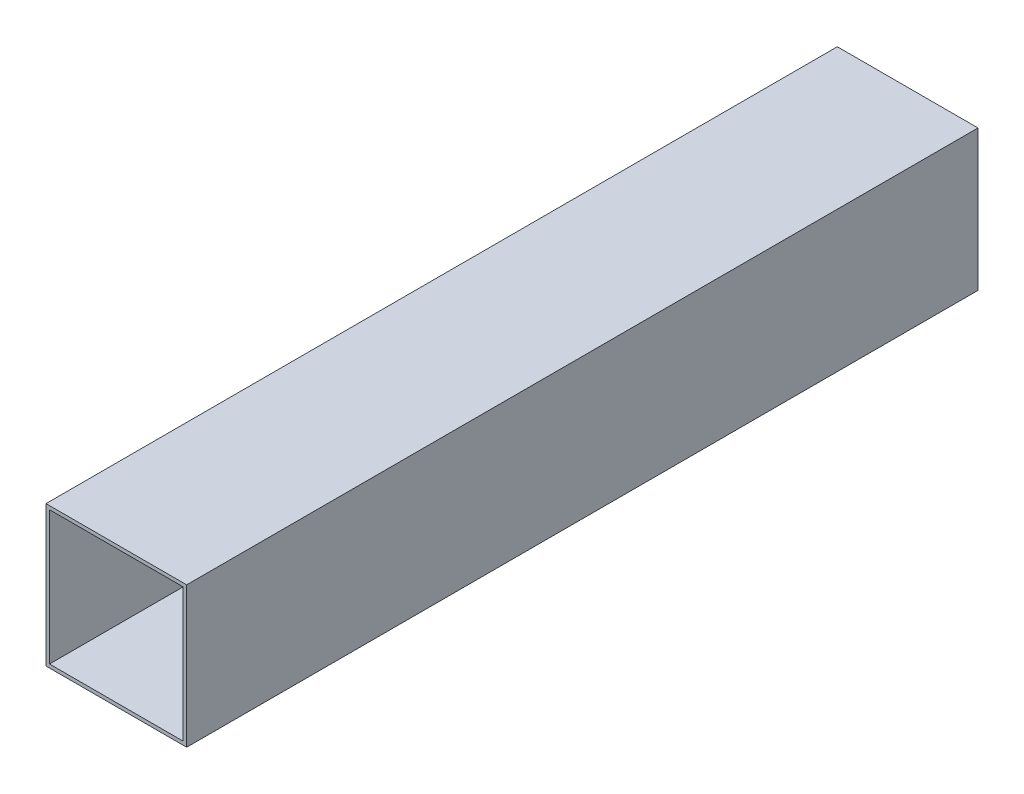
ISO-10303-21;
HEADER;
FILE_DESCRIPTION(('STEP AP214'),'2;1');
FILE_NAME('part.step','',(''),(''),'','','');
FILE_SCHEMA(('AUTOMOTIVE_DESIGN { 1 0 10303 214 1 1 1 1 }'));
ENDSEC;
DATA;
#1=APPLICATION_CONTEXT('core data for automotive mechanical design processes');
#2=APPLICATION_PROTOCOL_DEFINITION('international standard','automotive_design',2000,#1);
#3=PRODUCT_CONTEXT('',#1,'mechanical');
#4=PRODUCT('Part','Part','',(#3));
#5=PRODUCT_RELATED_PRODUCT_CATEGORY('part','',(#4));
#6=PRODUCT_DEFINITION_FORMATION('','',#4);
#7=PRODUCT_DEFINITION_CONTEXT('part definition',#1,'design');
#8=PRODUCT_DEFINITION('design','',#6,#7);
#9=PRODUCT_DEFINITION_SHAPE('','',#8);
#10=(LENGTH_UNIT() NAMED_UNIT(*) SI_UNIT(.MILLI.,.METRE.));
#11=(NAMED_UNIT(*) PLANE_ANGLE_UNIT() SI_UNIT($,.RADIAN.));
#12=(NAMED_UNIT(*) SI_UNIT($,.STERADIAN.) SOLID_ANGLE_UNIT());
#13=UNCERTAINTY_MEASURE_WITH_UNIT(LENGTH_MEASURE(1.E-05),#10,'distance_accuracy_value','');
#14=(GEOMETRIC_REPRESENTATION_CONTEXT(3) GLOBAL_UNCERTAINTY_ASSIGNED_CONTEXT((#13)) GLOBAL_UNIT_ASSIGNED_CONTEXT((#10,
#11,#12)) REPRESENTATION_CONTEXT('',''));
#15=CARTESIAN_POINT('',(0.,0.,0.));
#16=DIRECTION('',(0.,0.,1.));
#17=DIRECTION('',(1.,0.,0.));
#18=AXIS2_PLACEMENT_3D('',#15,#16,#17);
#19=CARTESIAN_POINT('',(0.,0.,225.));
#20=DIRECTION('',(0.,0.,-1.));
#21=DIRECTION('',(-1.,0.,0.));
#22=AXIS2_PLACEMENT_3D('',#19,#20,#21);
#23=PLANE('',#22);
#24=DIRECTION('',(0.,-1.,0.));
#25=VECTOR('',#24,1.);
#26=CARTESIAN_POINT('',(0.,0.,225.));
#27=LINE('',#26,#25);
#28=CARTESIAN_POINT('',(0.,40.,225.));
#29=VERTEX_POINT('',#28);
#30=CARTESIAN_POINT('',(0.,0.,225.));
#31=VERTEX_POINT('',#30);
#32=EDGE_CURVE('E136',#29,#31,#27,.T.);
#33=ORIENTED_EDGE('',*,*,#32,.T.);
#34=DIRECTION('',(1.,0.,0.));
#35=VECTOR('',#34,1.);
#36=CARTESIAN_POINT('',(0.,0.,225.));
#37=LINE('',#36,#35);
#38=CARTESIAN_POINT('',(40.,0.,225.));
#39=VERTEX_POINT('',#38);
#40=EDGE_CURVE('E139',#31,#39,#37,.T.);
#41=ORIENTED_EDGE('',*,*,#40,.T.);
#42=DIRECTION('',(0.,1.,0.));
#43=VECTOR('',#42,1.);
#44=CARTESIAN_POINT('',(40.,0.,225.));
#45=LINE('',#44,#43);
#46=CARTESIAN_POINT('',(40.,40.,225.));
#47=VERTEX_POINT('',#46);
#48=EDGE_CURVE('E142',#39,#47,#45,.T.);
#49=ORIENTED_EDGE('',*,*,#48,.T.);
#50=DIRECTION('',(-1.,0.,0.));
#51=VECTOR('',#50,1.);
#52=CARTESIAN_POINT('',(0.,40.,225.));
#53=LINE('',#52,#51);
#54=EDGE_CURVE('E144',#47,#29,#53,.T.);
#55=ORIENTED_EDGE('',*,*,#54,.T.);
#56=EDGE_LOOP('',(#33,#41,#49,#55));
#57=FACE_BOUND('',#56,.T.);
#58=DIRECTION('',(0.,-1.,0.));
#59=VECTOR('',#58,1.);
#60=CARTESIAN_POINT('',(1.,1.,225.));
#61=LINE('',#60,#59);
#62=CARTESIAN_POINT('',(1.,39.,225.));
#63=VERTEX_POINT('',#62);
#64=CARTESIAN_POINT('',(1.,1.,225.));
#65=VERTEX_POINT('',#64);
#66=EDGE_CURVE('E100',#63,#65,#61,.T.);
#67=ORIENTED_EDGE('',*,*,#66,.F.);
#68=DIRECTION('',(-1.,0.,0.));
#69=VECTOR('',#68,1.);
#70=CARTESIAN_POINT('',(1.,39.,225.));
#71=LINE('',#70,#69);
#72=CARTESIAN_POINT('',(39.,39.,225.));
#73=VERTEX_POINT('',#72);
#74=EDGE_CURVE('E122',#73,#63,#71,.T.);
#75=ORIENTED_EDGE('',*,*,#74,.F.);
#76=DIRECTION('',(0.,1.,0.));
#77=VECTOR('',#76,1.);
#78=CARTESIAN_POINT('',(39.,1.,225.));
#79=LINE('',#78,#77);
#80=CARTESIAN_POINT('',(39.,1.,225.));
#81=VERTEX_POINT('',#80);
#82=EDGE_CURVE('E120',#81,#73,#79,.T.);
#83=ORIENTED_EDGE('',*,*,#82,.F.);
#84=DIRECTION('',(1.,0.,0.));
#85=VECTOR('',#84,1.);
#86=CARTESIAN_POINT('',(1.,1.,225.));
#87=LINE('',#86,#85);
#88=EDGE_CURVE('E108',#65,#81,#87,.T.);
#89=ORIENTED_EDGE('',*,*,#88,.F.);
#90=EDGE_LOOP('',(#67,#75,#83,#89));
#91=FACE_BOUND('',#90,.T.);
#92=ADVANCED_FACE('F35',(#57,#91),#23,.F.);
#93=CARTESIAN_POINT('',(0.,0.,0.));
#94=DIRECTION('',(0.,0.,-1.));
#95=DIRECTION('',(-1.,0.,0.));
#96=AXIS2_PLACEMENT_3D('',#93,#94,#95);
#97=PLANE('',#96);
#98=DIRECTION('',(0.,-1.,0.));
#99=VECTOR('',#98,1.);
#100=CARTESIAN_POINT('',(0.,0.,0.));
#101=LINE('',#100,#99);
#102=CARTESIAN_POINT('',(0.,40.,0.));
#103=VERTEX_POINT('',#102);
#104=CARTESIAN_POINT('',(0.,0.,0.));
#105=VERTEX_POINT('',#104);
#106=EDGE_CURVE('E116',#103,#105,#101,.T.);
#107=ORIENTED_EDGE('',*,*,#106,.F.);
#108=DIRECTION('',(-1.,0.,0.));
#109=VECTOR('',#108,1.);
#110=CARTESIAN_POINT('',(0.,40.,0.));
#111=LINE('',#110,#109);
#112=CARTESIAN_POINT('',(40.,40.,0.));
#113=VERTEX_POINT('',#112);
#114=EDGE_CURVE('E140',#113,#103,#111,.T.);
#115=ORIENTED_EDGE('',*,*,#114,.F.);
#116=DIRECTION('',(0.,1.,0.));
#117=VECTOR('',#116,1.);
#118=CARTESIAN_POINT('',(40.,0.,0.));
#119=LINE('',#118,#117);
#120=CARTESIAN_POINT('',(40.,0.,0.));
#121=VERTEX_POINT('',#120);
#122=EDGE_CURVE('E151',#121,#113,#119,.T.);
#123=ORIENTED_EDGE('',*,*,#122,.F.);
#124=DIRECTION('',(1.,0.,0.));
#125=VECTOR('',#124,1.);
#126=CARTESIAN_POINT('',(0.,0.,0.));
#127=LINE('',#126,#125);
#128=EDGE_CURVE('E149',#105,#121,#127,.T.);
#129=ORIENTED_EDGE('',*,*,#128,.F.);
#130=EDGE_LOOP('',(#107,#115,#123,#129));
#131=FACE_BOUND('',#130,.T.);
#132=DIRECTION('',(-1.,0.,0.));
#133=VECTOR('',#132,1.);
#134=CARTESIAN_POINT('',(1.,39.,0.));
#135=LINE('',#134,#133);
#136=CARTESIAN_POINT('',(39.,39.,0.));
#137=VERTEX_POINT('',#136);
#138=CARTESIAN_POINT('',(1.,39.,0.));
#139=VERTEX_POINT('',#138);
#140=EDGE_CURVE('E109',#137,#139,#135,.T.);
#141=ORIENTED_EDGE('',*,*,#140,.T.);
#142=DIRECTION('',(0.,-1.,0.));
#143=VECTOR('',#142,1.);
#144=CARTESIAN_POINT('',(1.,1.,0.));
#145=LINE('',#144,#143);
#146=CARTESIAN_POINT('',(1.,1.,0.));
#147=VERTEX_POINT('',#146);
#148=EDGE_CURVE('E58',#139,#147,#145,.T.);
#149=ORIENTED_EDGE('',*,*,#148,.T.);
#150=DIRECTION('',(1.,0.,0.));
#151=VECTOR('',#150,1.);
#152=CARTESIAN_POINT('',(1.,1.,0.));
#153=LINE('',#152,#151);
#154=CARTESIAN_POINT('',(39.,1.,0.));
#155=VERTEX_POINT('',#154);
#156=EDGE_CURVE('E115',#147,#155,#153,.T.);
#157=ORIENTED_EDGE('',*,*,#156,.T.);
#158=DIRECTION('',(0.,1.,0.));
#159=VECTOR('',#158,1.);
#160=CARTESIAN_POINT('',(39.,1.,0.));
#161=LINE('',#160,#159);
#162=EDGE_CURVE('E128',#155,#137,#161,.T.);
#163=ORIENTED_EDGE('',*,*,#162,.T.);
#164=EDGE_LOOP('',(#141,#149,#157,#163));
#165=FACE_BOUND('',#164,.T.);
#166=ADVANCED_FACE('F169',(#131,#165),#97,.T.);
#167=CARTESIAN_POINT('',(0.,0.,225.));
#168=DIRECTION('',(1.,0.,0.));
#169=DIRECTION('',(0.,0.,-1.));
#170=AXIS2_PLACEMENT_3D('',#167,#168,#169);
#171=PLANE('',#170);
#172=ORIENTED_EDGE('',*,*,#106,.T.);
#173=DIRECTION('',(0.,0.,-1.));
#174=VECTOR('',#173,1.);
#175=CARTESIAN_POINT('',(0.,0.,225.));
#176=LINE('',#175,#174);
#177=EDGE_CURVE('E11',#31,#105,#176,.T.);
#178=ORIENTED_EDGE('',*,*,#177,.F.);
#179=ORIENTED_EDGE('',*,*,#32,.F.);
#180=DIRECTION('',(0.,0.,-1.));
#181=VECTOR('',#180,1.);
#182=CARTESIAN_POINT('',(0.,40.,225.));
#183=LINE('',#182,#181);
#184=EDGE_CURVE('E146',#29,#103,#183,.T.);
#185=ORIENTED_EDGE('',*,*,#184,.T.);
#186=EDGE_LOOP('',(#172,#178,#179,#185));
#187=FACE_BOUND('',#186,.T.);
#188=ADVANCED_FACE('F37',(#187),#171,.F.);
#189=CARTESIAN_POINT('',(0.,0.,225.));
#190=DIRECTION('',(0.,1.,0.));
#191=DIRECTION('',(0.,0.,1.));
#192=AXIS2_PLACEMENT_3D('',#189,#190,#191);
#193=PLANE('',#192);
#194=ORIENTED_EDGE('',*,*,#128,.T.);
#195=DIRECTION('',(0.,0.,-1.));
#196=VECTOR('',#195,1.);
#197=CARTESIAN_POINT('',(40.,0.,225.));
#198=LINE('',#197,#196);
#199=EDGE_CURVE('E43',#39,#121,#198,.T.);
#200=ORIENTED_EDGE('',*,*,#199,.F.);
#201=ORIENTED_EDGE('',*,*,#40,.F.);
#202=ORIENTED_EDGE('',*,*,#177,.T.);
#203=EDGE_LOOP('',(#194,#200,#201,#202));
#204=FACE_BOUND('',#203,.T.);
#205=ADVANCED_FACE('F179',(#204),#193,.F.);
#206=CARTESIAN_POINT('',(40.,0.,225.));
#207=DIRECTION('',(-1.,0.,0.));
#208=DIRECTION('',(0.,0.,1.));
#209=AXIS2_PLACEMENT_3D('',#206,#207,#208);
#210=PLANE('',#209);
#211=ORIENTED_EDGE('',*,*,#122,.T.);
#212=DIRECTION('',(0.,0.,-1.));
#213=VECTOR('',#212,1.);
#214=CARTESIAN_POINT('',(40.,40.,225.));
#215=LINE('',#214,#213);
#216=EDGE_CURVE('E156',#47,#113,#215,.T.);
#217=ORIENTED_EDGE('',*,*,#216,.F.);
#218=ORIENTED_EDGE('',*,*,#48,.F.);
#219=ORIENTED_EDGE('',*,*,#199,.T.);
#220=EDGE_LOOP('',(#211,#217,#218,#219));
#221=FACE_BOUND('',#220,.T.);
#222=ADVANCED_FACE('F163',(#221),#210,.F.);
#223=CARTESIAN_POINT('',(0.,40.,225.));
#224=DIRECTION('',(0.,-1.,0.));
#225=DIRECTION('',(0.,0.,-1.));
#226=AXIS2_PLACEMENT_3D('',#223,#224,#225);
#227=PLANE('',#226);
#228=ORIENTED_EDGE('',*,*,#114,.T.);
#229=ORIENTED_EDGE('',*,*,#184,.F.);
#230=ORIENTED_EDGE('',*,*,#54,.F.);
#231=ORIENTED_EDGE('',*,*,#216,.T.);
#232=EDGE_LOOP('',(#228,#229,#230,#231));
#233=FACE_BOUND('',#232,.T.);
#234=ADVANCED_FACE('F173',(#233),#227,.F.);
#235=CARTESIAN_POINT('',(1.,1.,225.));
#236=DIRECTION('',(1.,0.,0.));
#237=DIRECTION('',(0.,0.,-1.));
#238=AXIS2_PLACEMENT_3D('',#235,#236,#237);
#239=PLANE('',#238);
#240=ORIENTED_EDGE('',*,*,#148,.F.);
#241=DIRECTION('',(0.,0.,-1.));
#242=VECTOR('',#241,1.);
#243=CARTESIAN_POINT('',(1.,39.,225.));
#244=LINE('',#243,#242);
#245=EDGE_CURVE('E104',#63,#139,#244,.T.);
#246=ORIENTED_EDGE('',*,*,#245,.F.);
#247=ORIENTED_EDGE('',*,*,#66,.T.);
#248=DIRECTION('',(0.,0.,-1.));
#249=VECTOR('',#248,1.);
#250=CARTESIAN_POINT('',(1.,1.,225.));
#251=LINE('',#250,#249);
#252=EDGE_CURVE('E103',#65,#147,#251,.T.);
#253=ORIENTED_EDGE('',*,*,#252,.T.);
#254=EDGE_LOOP('',(#240,#246,#247,#253));
#255=FACE_BOUND('',#254,.T.);
#256=ADVANCED_FACE('F102',(#255),#239,.T.);
#257=CARTESIAN_POINT('',(1.,1.,225.));
#258=DIRECTION('',(0.,1.,0.));
#259=DIRECTION('',(0.,0.,1.));
#260=AXIS2_PLACEMENT_3D('',#257,#258,#259);
#261=PLANE('',#260);
#262=ORIENTED_EDGE('',*,*,#156,.F.);
#263=ORIENTED_EDGE('',*,*,#252,.F.);
#264=ORIENTED_EDGE('',*,*,#88,.T.);
#265=DIRECTION('',(0.,0.,-1.));
#266=VECTOR('',#265,1.);
#267=CARTESIAN_POINT('',(39.,1.,225.));
#268=LINE('',#267,#266);
#269=EDGE_CURVE('E117',#81,#155,#268,.T.);
#270=ORIENTED_EDGE('',*,*,#269,.T.);
#271=EDGE_LOOP('',(#262,#263,#264,#270));
#272=FACE_BOUND('',#271,.T.);
#273=ADVANCED_FACE('F112',(#272),#261,.T.);
#274=CARTESIAN_POINT('',(39.,1.,225.));
#275=DIRECTION('',(-1.,0.,0.));
#276=DIRECTION('',(0.,0.,1.));
#277=AXIS2_PLACEMENT_3D('',#274,#275,#276);
#278=PLANE('',#277);
#279=ORIENTED_EDGE('',*,*,#162,.F.);
#280=ORIENTED_EDGE('',*,*,#269,.F.);
#281=ORIENTED_EDGE('',*,*,#82,.T.);
#282=DIRECTION('',(0.,0.,-1.));
#283=VECTOR('',#282,1.);
#284=CARTESIAN_POINT('',(39.,39.,225.));
#285=LINE('',#284,#283);
#286=EDGE_CURVE('E50',#73,#137,#285,.T.);
#287=ORIENTED_EDGE('',*,*,#286,.T.);
#288=EDGE_LOOP('',(#279,#280,#281,#287));
#289=FACE_BOUND('',#288,.T.);
#290=ADVANCED_FACE('F202',(#289),#278,.T.);
#291=CARTESIAN_POINT('',(1.,39.,225.));
#292=DIRECTION('',(0.,-1.,0.));
#293=DIRECTION('',(0.,0.,-1.));
#294=AXIS2_PLACEMENT_3D('',#291,#292,#293);
#295=PLANE('',#294);
#296=ORIENTED_EDGE('',*,*,#140,.F.);
#297=ORIENTED_EDGE('',*,*,#286,.F.);
#298=ORIENTED_EDGE('',*,*,#74,.T.);
#299=ORIENTED_EDGE('',*,*,#245,.T.);
#300=EDGE_LOOP('',(#296,#297,#298,#299));
#301=FACE_BOUND('',#300,.T.);
#302=ADVANCED_FACE('F206',(#301),#295,.T.);
#303=CLOSED_SHELL('',(#92,#166,#188,#205,#222,#234,#256,#273,#290,#302));
#304=MANIFOLD_SOLID_BREP('B2',#303);
#305=ADVANCED_BREP_SHAPE_REPRESENTATION('',(#18,#304),#14);
#306=SHAPE_DEFINITION_REPRESENTATION(#9,#305);
ENDSEC;
END-ISO-10303-21;
